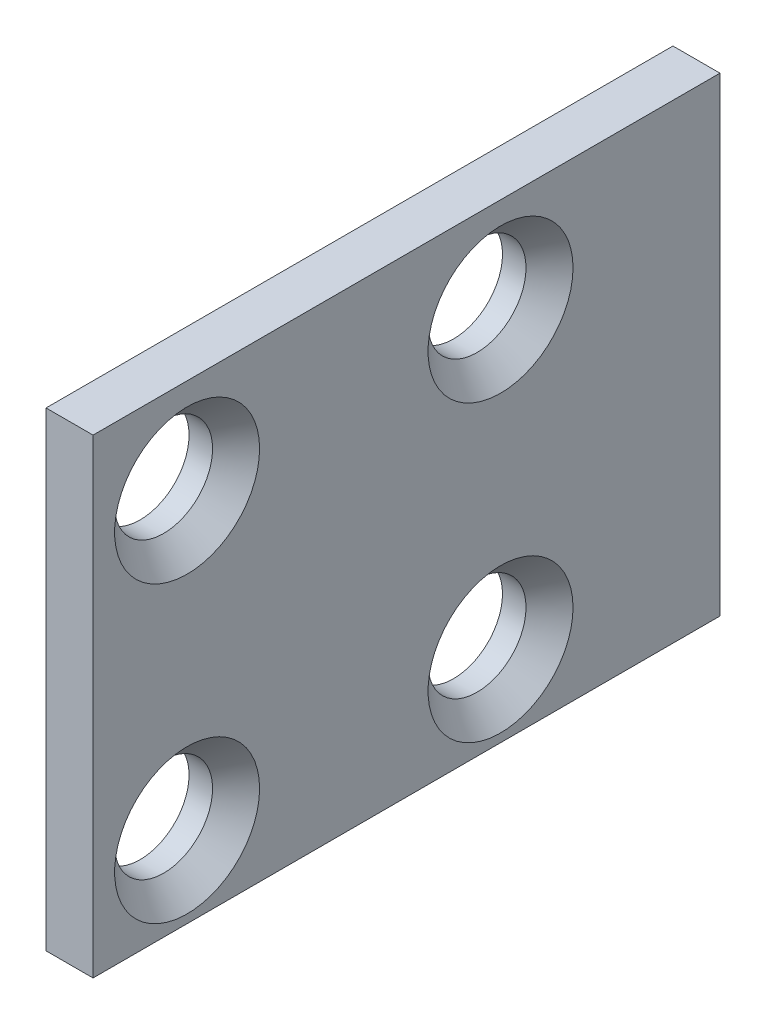
ISO-10303-21;
HEADER;
FILE_DESCRIPTION(('STEP AP214'),'2;1');
FILE_NAME('part.step','',(''),(''),'','','');
FILE_SCHEMA(('AUTOMOTIVE_DESIGN { 1 0 10303 214 1 1 1 1 }'));
ENDSEC;
DATA;
#1=APPLICATION_CONTEXT('core data for automotive mechanical design processes');
#2=APPLICATION_PROTOCOL_DEFINITION('international standard','automotive_design',2000,#1);
#3=PRODUCT_CONTEXT('',#1,'mechanical');
#4=PRODUCT('Part','Part','',(#3));
#5=PRODUCT_RELATED_PRODUCT_CATEGORY('part','',(#4));
#6=PRODUCT_DEFINITION_FORMATION('','',#4);
#7=PRODUCT_DEFINITION_CONTEXT('part definition',#1,'design');
#8=PRODUCT_DEFINITION('design','',#6,#7);
#9=PRODUCT_DEFINITION_SHAPE('','',#8);
#10=(LENGTH_UNIT() NAMED_UNIT(*) SI_UNIT(.MILLI.,.METRE.));
#11=(NAMED_UNIT(*) PLANE_ANGLE_UNIT() SI_UNIT($,.RADIAN.));
#12=(NAMED_UNIT(*) SI_UNIT($,.STERADIAN.) SOLID_ANGLE_UNIT());
#13=UNCERTAINTY_MEASURE_WITH_UNIT(LENGTH_MEASURE(1.E-05),#10,'distance_accuracy_value','');
#14=(GEOMETRIC_REPRESENTATION_CONTEXT(3) GLOBAL_UNCERTAINTY_ASSIGNED_CONTEXT((#13)) GLOBAL_UNIT_ASSIGNED_CONTEXT((#10,
#11,#12)) REPRESENTATION_CONTEXT('',''));
#15=CARTESIAN_POINT('',(0.,0.,0.));
#16=DIRECTION('',(0.,0.,1.));
#17=DIRECTION('',(1.,0.,0.));
#18=AXIS2_PLACEMENT_3D('',#15,#16,#17);
#19=CARTESIAN_POINT('',(6.,0.,0.));
#20=DIRECTION('',(1.,0.,0.));
#21=DIRECTION('',(0.,0.,-1.));
#22=AXIS2_PLACEMENT_3D('',#19,#20,#21);
#23=PLANE('',#22);
#24=CARTESIAN_POINT('',(6.,10.3277292459547,-12.));
#25=DIRECTION('',(1.,0.,0.));
#26=DIRECTION('',(0.,0.,-1.));
#27=AXIS2_PLACEMENT_3D('',#24,#25,#26);
#28=CIRCLE('',#27,9.25000000000005);
#29=CARTESIAN_POINT('',(6.,10.3277292459547,-21.2500000000001));
#30=VERTEX_POINT('',#29);
#31=EDGE_CURVE('E125',#30,#30,#28,.F.);
#32=ORIENTED_EDGE('',*,*,#31,.T.);
#33=EDGE_LOOP('',(#32));
#34=FACE_BOUND('',#33,.T.);
#35=CARTESIAN_POINT('',(6.,10.3277292459547,-52.));
#36=DIRECTION('',(1.,0.,0.));
#37=DIRECTION('',(0.,0.,-1.));
#38=AXIS2_PLACEMENT_3D('',#35,#36,#37);
#39=CIRCLE('',#38,9.25000000000003);
#40=CARTESIAN_POINT('',(6.,10.3277292459547,-61.25));
#41=VERTEX_POINT('',#40);
#42=EDGE_CURVE('E122',#41,#41,#39,.F.);
#43=ORIENTED_EDGE('',*,*,#42,.T.);
#44=EDGE_LOOP('',(#43));
#45=FACE_BOUND('',#44,.T.);
#46=CARTESIAN_POINT('',(6.,47.8722372206188,-52.));
#47=DIRECTION('',(1.,0.,0.));
#48=DIRECTION('',(0.,0.,-1.));
#49=AXIS2_PLACEMENT_3D('',#46,#47,#48);
#50=CIRCLE('',#49,9.25000000000006);
#51=CARTESIAN_POINT('',(6.,47.8722372206188,-61.2500000000001));
#52=VERTEX_POINT('',#51);
#53=EDGE_CURVE('E119',#52,#52,#50,.F.);
#54=ORIENTED_EDGE('',*,*,#53,.T.);
#55=EDGE_LOOP('',(#54));
#56=FACE_BOUND('',#55,.T.);
#57=CARTESIAN_POINT('',(6.,47.8722372206188,-12.));
#58=DIRECTION('',(1.,0.,0.));
#59=DIRECTION('',(0.,0.,-1.));
#60=AXIS2_PLACEMENT_3D('',#57,#58,#59);
#61=CIRCLE('',#60,9.25000000000002);
#62=CARTESIAN_POINT('',(6.,47.8722372206188,-21.25));
#63=VERTEX_POINT('',#62);
#64=EDGE_CURVE('E116',#63,#63,#61,.F.);
#65=ORIENTED_EDGE('',*,*,#64,.T.);
#66=EDGE_LOOP('',(#65));
#67=FACE_BOUND('',#66,.T.);
#68=DIRECTION('',(0.,-1.,0.));
#69=VECTOR('',#68,1.);
#70=CARTESIAN_POINT('',(6.,60.,0.));
#71=LINE('',#70,#69);
#72=CARTESIAN_POINT('',(6.,60.,0.));
#73=VERTEX_POINT('',#72);
#74=CARTESIAN_POINT('',(6.,0.,0.));
#75=VERTEX_POINT('',#74);
#76=EDGE_CURVE('E88',#73,#75,#71,.T.);
#77=ORIENTED_EDGE('',*,*,#76,.T.);
#78=DIRECTION('',(0.,0.,-1.));
#79=VECTOR('',#78,1.);
#80=CARTESIAN_POINT('',(6.,0.,0.));
#81=LINE('',#80,#79);
#82=CARTESIAN_POINT('',(6.,0.,-80.));
#83=VERTEX_POINT('',#82);
#84=EDGE_CURVE('E84',#75,#83,#81,.T.);
#85=ORIENTED_EDGE('',*,*,#84,.T.);
#86=DIRECTION('',(0.,1.,0.));
#87=VECTOR('',#86,1.);
#88=CARTESIAN_POINT('',(6.,0.,-80.));
#89=LINE('',#88,#87);
#90=CARTESIAN_POINT('',(6.,60.,-80.));
#91=VERTEX_POINT('',#90);
#92=EDGE_CURVE('E86',#83,#91,#89,.T.);
#93=ORIENTED_EDGE('',*,*,#92,.T.);
#94=DIRECTION('',(0.,0.,1.));
#95=VECTOR('',#94,1.);
#96=CARTESIAN_POINT('',(6.,60.,-80.));
#97=LINE('',#96,#95);
#98=EDGE_CURVE('E53',#91,#73,#97,.T.);
#99=ORIENTED_EDGE('',*,*,#98,.T.);
#100=EDGE_LOOP('',(#77,#85,#93,#99));
#101=FACE_BOUND('',#100,.T.);
#102=ADVANCED_FACE('F36',(#34,#45,#56,#67,#101),#23,.T.);
#103=CARTESIAN_POINT('',(0.,0.,0.));
#104=DIRECTION('',(1.,0.,0.));
#105=DIRECTION('',(0.,0.,-1.));
#106=AXIS2_PLACEMENT_3D('',#103,#104,#105);
#107=PLANE('',#106);
#108=DIRECTION('',(0.,-1.,0.));
#109=VECTOR('',#108,1.);
#110=CARTESIAN_POINT('',(0.,60.,0.));
#111=LINE('',#110,#109);
#112=CARTESIAN_POINT('',(0.,60.,0.));
#113=VERTEX_POINT('',#112);
#114=CARTESIAN_POINT('',(0.,0.,0.));
#115=VERTEX_POINT('',#114);
#116=EDGE_CURVE('E103',#113,#115,#111,.T.);
#117=ORIENTED_EDGE('',*,*,#116,.F.);
#118=DIRECTION('',(0.,0.,1.));
#119=VECTOR('',#118,1.);
#120=CARTESIAN_POINT('',(0.,60.,-80.));
#121=LINE('',#120,#119);
#122=CARTESIAN_POINT('',(0.,60.,-80.));
#123=VERTEX_POINT('',#122);
#124=EDGE_CURVE('E76',#123,#113,#121,.T.);
#125=ORIENTED_EDGE('',*,*,#124,.F.);
#126=DIRECTION('',(0.,1.,0.));
#127=VECTOR('',#126,1.);
#128=CARTESIAN_POINT('',(0.,0.,-80.));
#129=LINE('',#128,#127);
#130=CARTESIAN_POINT('',(0.,0.,-80.));
#131=VERTEX_POINT('',#130);
#132=EDGE_CURVE('E70',#131,#123,#129,.T.);
#133=ORIENTED_EDGE('',*,*,#132,.F.);
#134=DIRECTION('',(0.,0.,-1.));
#135=VECTOR('',#134,1.);
#136=CARTESIAN_POINT('',(0.,0.,0.));
#137=LINE('',#136,#135);
#138=EDGE_CURVE('E93',#115,#131,#137,.T.);
#139=ORIENTED_EDGE('',*,*,#138,.F.);
#140=EDGE_LOOP('',(#117,#125,#133,#139));
#141=FACE_BOUND('',#140,.T.);
#142=CARTESIAN_POINT('',(0.,10.3277292459547,-12.));
#143=DIRECTION('',(1.,0.,0.));
#144=DIRECTION('',(0.,0.,-1.));
#145=AXIS2_PLACEMENT_3D('',#142,#143,#144);
#146=CIRCLE('',#145,6.25);
#147=CARTESIAN_POINT('',(0.,10.3277292459547,-18.25));
#148=VERTEX_POINT('',#147);
#149=EDGE_CURVE('E106',#148,#148,#146,.T.);
#150=ORIENTED_EDGE('',*,*,#149,.T.);
#151=EDGE_LOOP('',(#150));
#152=FACE_BOUND('',#151,.T.);
#153=CARTESIAN_POINT('',(0.,47.8722372206188,-12.));
#154=DIRECTION('',(1.,0.,0.));
#155=DIRECTION('',(0.,0.,-1.));
#156=AXIS2_PLACEMENT_3D('',#153,#154,#155);
#157=CIRCLE('',#156,6.25);
#158=CARTESIAN_POINT('',(0.,47.8722372206188,-18.25));
#159=VERTEX_POINT('',#158);
#160=EDGE_CURVE('E192',#159,#159,#157,.T.);
#161=ORIENTED_EDGE('',*,*,#160,.T.);
#162=EDGE_LOOP('',(#161));
#163=FACE_BOUND('',#162,.T.);
#164=CARTESIAN_POINT('',(0.,47.8722372206188,-52.));
#165=DIRECTION('',(1.,0.,0.));
#166=DIRECTION('',(0.,0.,-1.));
#167=AXIS2_PLACEMENT_3D('',#164,#165,#166);
#168=CIRCLE('',#167,6.25000000000001);
#169=CARTESIAN_POINT('',(0.,47.8722372206188,-58.25));
#170=VERTEX_POINT('',#169);
#171=EDGE_CURVE('E195',#170,#170,#168,.T.);
#172=ORIENTED_EDGE('',*,*,#171,.T.);
#173=EDGE_LOOP('',(#172));
#174=FACE_BOUND('',#173,.T.);
#175=CARTESIAN_POINT('',(0.,10.3277292459547,-52.));
#176=DIRECTION('',(1.,0.,0.));
#177=DIRECTION('',(0.,0.,-1.));
#178=AXIS2_PLACEMENT_3D('',#175,#176,#177);
#179=CIRCLE('',#178,6.25);
#180=CARTESIAN_POINT('',(0.,10.3277292459547,-58.25));
#181=VERTEX_POINT('',#180);
#182=EDGE_CURVE('E200',#181,#181,#179,.T.);
#183=ORIENTED_EDGE('',*,*,#182,.T.);
#184=EDGE_LOOP('',(#183));
#185=FACE_BOUND('',#184,.T.);
#186=ADVANCED_FACE('F150',(#141,#152,#163,#174,#185),#107,.F.);
#187=CARTESIAN_POINT('',(6.,60.,0.));
#188=DIRECTION('',(0.,0.,-1.));
#189=DIRECTION('',(-1.,0.,0.));
#190=AXIS2_PLACEMENT_3D('',#187,#188,#189);
#191=PLANE('',#190);
#192=ORIENTED_EDGE('',*,*,#116,.T.);
#193=DIRECTION('',(-1.,0.,0.));
#194=VECTOR('',#193,1.);
#195=CARTESIAN_POINT('',(6.,0.,0.));
#196=LINE('',#195,#194);
#197=EDGE_CURVE('E94',#75,#115,#196,.T.);
#198=ORIENTED_EDGE('',*,*,#197,.F.);
#199=ORIENTED_EDGE('',*,*,#76,.F.);
#200=DIRECTION('',(-1.,0.,0.));
#201=VECTOR('',#200,1.);
#202=CARTESIAN_POINT('',(6.,60.,0.));
#203=LINE('',#202,#201);
#204=EDGE_CURVE('E99',#73,#113,#203,.T.);
#205=ORIENTED_EDGE('',*,*,#204,.T.);
#206=EDGE_LOOP('',(#192,#198,#199,#205));
#207=FACE_BOUND('',#206,.T.);
#208=ADVANCED_FACE('F156',(#207),#191,.F.);
#209=CARTESIAN_POINT('',(6.,0.,0.));
#210=DIRECTION('',(0.,1.,0.));
#211=DIRECTION('',(0.,0.,1.));
#212=AXIS2_PLACEMENT_3D('',#209,#210,#211);
#213=PLANE('',#212);
#214=ORIENTED_EDGE('',*,*,#138,.T.);
#215=DIRECTION('',(-1.,0.,0.));
#216=VECTOR('',#215,1.);
#217=CARTESIAN_POINT('',(6.,0.,-80.));
#218=LINE('',#217,#216);
#219=EDGE_CURVE('E91',#83,#131,#218,.T.);
#220=ORIENTED_EDGE('',*,*,#219,.F.);
#221=ORIENTED_EDGE('',*,*,#84,.F.);
#222=ORIENTED_EDGE('',*,*,#197,.T.);
#223=EDGE_LOOP('',(#214,#220,#221,#222));
#224=FACE_BOUND('',#223,.T.);
#225=ADVANCED_FACE('F92',(#224),#213,.F.);
#226=CARTESIAN_POINT('',(6.,0.,-80.));
#227=DIRECTION('',(0.,0.,1.));
#228=DIRECTION('',(1.,0.,0.));
#229=AXIS2_PLACEMENT_3D('',#226,#227,#228);
#230=PLANE('',#229);
#231=ORIENTED_EDGE('',*,*,#132,.T.);
#232=DIRECTION('',(-1.,0.,0.));
#233=VECTOR('',#232,1.);
#234=CARTESIAN_POINT('',(6.,60.,-80.));
#235=LINE('',#234,#233);
#236=EDGE_CURVE('E95',#91,#123,#235,.T.);
#237=ORIENTED_EDGE('',*,*,#236,.F.);
#238=ORIENTED_EDGE('',*,*,#92,.F.);
#239=ORIENTED_EDGE('',*,*,#219,.T.);
#240=EDGE_LOOP('',(#231,#237,#238,#239));
#241=FACE_BOUND('',#240,.T.);
#242=ADVANCED_FACE('F97',(#241),#230,.F.);
#243=CARTESIAN_POINT('',(6.,60.,-80.));
#244=DIRECTION('',(0.,-1.,0.));
#245=DIRECTION('',(0.,0.,-1.));
#246=AXIS2_PLACEMENT_3D('',#243,#244,#245);
#247=PLANE('',#246);
#248=ORIENTED_EDGE('',*,*,#124,.T.);
#249=ORIENTED_EDGE('',*,*,#204,.F.);
#250=ORIENTED_EDGE('',*,*,#98,.F.);
#251=ORIENTED_EDGE('',*,*,#236,.T.);
#252=EDGE_LOOP('',(#248,#249,#250,#251));
#253=FACE_BOUND('',#252,.T.);
#254=ADVANCED_FACE('F164',(#253),#247,.F.);
#255=CARTESIAN_POINT('',(6.,10.3277292459547,-12.));
#256=DIRECTION('',(-1.,0.,0.));
#257=DIRECTION('',(0.,0.,1.));
#258=AXIS2_PLACEMENT_3D('',#255,#256,#257);
#259=CYLINDRICAL_SURFACE('',#258,6.25);
#260=CARTESIAN_POINT('',(2.99999999999997,10.3277292459547,-12.));
#261=DIRECTION('',(1.,0.,0.));
#262=DIRECTION('',(0.,0.,-1.));
#263=AXIS2_PLACEMENT_3D('',#260,#261,#262);
#264=CIRCLE('',#263,6.25);
#265=CARTESIAN_POINT('',(2.99999999999997,10.3277292459547,-18.25));
#266=VERTEX_POINT('',#265);
#267=EDGE_CURVE('E113',#266,#266,#264,.T.);
#268=ORIENTED_EDGE('',*,*,#267,.T.);
#269=EDGE_LOOP('',(#268));
#270=FACE_BOUND('',#269,.T.);
#271=ORIENTED_EDGE('',*,*,#149,.F.);
#272=EDGE_LOOP('',(#271));
#273=FACE_BOUND('',#272,.T.);
#274=ADVANCED_FACE('F161',(#270,#273),#259,.F.);
#275=CARTESIAN_POINT('',(6.,47.8722372206188,-12.));
#276=DIRECTION('',(-1.,0.,0.));
#277=DIRECTION('',(0.,0.,1.));
#278=AXIS2_PLACEMENT_3D('',#275,#276,#277);
#279=CYLINDRICAL_SURFACE('',#278,6.25);
#280=CARTESIAN_POINT('',(2.99999999999998,47.8722372206188,-12.));
#281=DIRECTION('',(1.,0.,0.));
#282=DIRECTION('',(0.,0.,-1.));
#283=AXIS2_PLACEMENT_3D('',#280,#281,#282);
#284=CIRCLE('',#283,6.25);
#285=CARTESIAN_POINT('',(2.99999999999998,47.8722372206188,-18.25));
#286=VERTEX_POINT('',#285);
#287=EDGE_CURVE('E11',#286,#286,#284,.T.);
#288=ORIENTED_EDGE('',*,*,#287,.T.);
#289=EDGE_LOOP('',(#288));
#290=FACE_BOUND('',#289,.T.);
#291=ORIENTED_EDGE('',*,*,#160,.F.);
#292=EDGE_LOOP('',(#291));
#293=FACE_BOUND('',#292,.T.);
#294=ADVANCED_FACE('F188',(#290,#293),#279,.F.);
#295=CARTESIAN_POINT('',(6.,47.8722372206188,-52.));
#296=DIRECTION('',(-1.,0.,0.));
#297=DIRECTION('',(0.,0.,1.));
#298=AXIS2_PLACEMENT_3D('',#295,#296,#297);
#299=CYLINDRICAL_SURFACE('',#298,6.25000000000001);
#300=CARTESIAN_POINT('',(2.99999999999998,47.8722372206188,-52.));
#301=DIRECTION('',(1.,0.,0.));
#302=DIRECTION('',(0.,0.,-1.));
#303=AXIS2_PLACEMENT_3D('',#300,#301,#302);
#304=CIRCLE('',#303,6.25000000000001);
#305=CARTESIAN_POINT('',(2.99999999999998,47.8722372206188,-58.25));
#306=VERTEX_POINT('',#305);
#307=EDGE_CURVE('E45',#306,#306,#304,.T.);
#308=ORIENTED_EDGE('',*,*,#307,.T.);
#309=EDGE_LOOP('',(#308));
#310=FACE_BOUND('',#309,.T.);
#311=ORIENTED_EDGE('',*,*,#171,.F.);
#312=EDGE_LOOP('',(#311));
#313=FACE_BOUND('',#312,.T.);
#314=ADVANCED_FACE('F133',(#310,#313),#299,.F.);
#315=CARTESIAN_POINT('',(6.,10.3277292459547,-52.));
#316=DIRECTION('',(-1.,0.,0.));
#317=DIRECTION('',(0.,0.,1.));
#318=AXIS2_PLACEMENT_3D('',#315,#316,#317);
#319=CYLINDRICAL_SURFACE('',#318,6.25);
#320=CARTESIAN_POINT('',(2.99999999999999,10.3277292459547,-52.));
#321=DIRECTION('',(1.,0.,0.));
#322=DIRECTION('',(0.,0.,-1.));
#323=AXIS2_PLACEMENT_3D('',#320,#321,#322);
#324=CIRCLE('',#323,6.25);
#325=CARTESIAN_POINT('',(2.99999999999998,10.3277292459547,-58.25));
#326=VERTEX_POINT('',#325);
#327=EDGE_CURVE('E128',#326,#326,#324,.T.);
#328=ORIENTED_EDGE('',*,*,#327,.T.);
#329=EDGE_LOOP('',(#328));
#330=FACE_BOUND('',#329,.T.);
#331=ORIENTED_EDGE('',*,*,#182,.F.);
#332=EDGE_LOOP('',(#331));
#333=FACE_BOUND('',#332,.T.);
#334=ADVANCED_FACE('F175',(#330,#333),#319,.F.);
#335=CARTESIAN_POINT('',(2.99999999999997,10.3277292459547,-12.));
#336=DIRECTION('',(1.,0.,0.));
#337=DIRECTION('',(0.,0.,-1.));
#338=AXIS2_PLACEMENT_3D('',#335,#336,#337);
#339=CONICAL_SURFACE('',#338,6.25,0.785398163397452);
#340=ORIENTED_EDGE('',*,*,#31,.F.);
#341=EDGE_LOOP('',(#340));
#342=FACE_BOUND('',#341,.T.);
#343=ORIENTED_EDGE('',*,*,#267,.F.);
#344=EDGE_LOOP('',(#343));
#345=FACE_BOUND('',#344,.T.);
#346=ADVANCED_FACE('F145',(#342,#345),#339,.F.);
#347=CARTESIAN_POINT('',(2.99999999999999,10.3277292459547,-52.));
#348=DIRECTION('',(1.,0.,0.));
#349=DIRECTION('',(0.,0.,-1.));
#350=AXIS2_PLACEMENT_3D('',#347,#348,#349);
#351=CONICAL_SURFACE('',#350,6.25,0.78539816339745);
#352=CARTESIAN_POINT('',(6.,10.3277292459547,-61.25));
#353=CARTESIAN_POINT('',(5.96875,10.3277292459547,-61.21875));
#354=CARTESIAN_POINT('',(5.9375,10.3277292459547,-61.1875));
#355=CARTESIAN_POINT('',(5.875,10.3277292459547,-61.125));
#356=CARTESIAN_POINT('',(5.84375,10.3277292459547,-61.09375));
#357=CARTESIAN_POINT('',(5.78125,10.3277292459547,-61.03125));
#358=CARTESIAN_POINT('',(5.75,10.3277292459547,-61.));
#359=CARTESIAN_POINT('',(5.6875,10.3277292459547,-60.9375));
#360=CARTESIAN_POINT('',(5.65625,10.3277292459547,-60.90625));
#361=CARTESIAN_POINT('',(5.59375,10.3277292459547,-60.84375));
#362=CARTESIAN_POINT('',(5.5625,10.3277292459547,-60.8125));
#363=CARTESIAN_POINT('',(5.5,10.3277292459547,-60.75));
#364=CARTESIAN_POINT('',(5.46875,10.3277292459547,-60.71875));
#365=CARTESIAN_POINT('',(5.40625,10.3277292459547,-60.65625));
#366=CARTESIAN_POINT('',(5.375,10.3277292459547,-60.625));
#367=CARTESIAN_POINT('',(5.3125,10.3277292459547,-60.5625));
#368=CARTESIAN_POINT('',(5.28125,10.3277292459547,-60.53125));
#369=CARTESIAN_POINT('',(5.21875,10.3277292459547,-60.46875));
#370=CARTESIAN_POINT('',(5.1875,10.3277292459547,-60.4375));
#371=CARTESIAN_POINT('',(5.12499999999999,10.3277292459547,-60.375));
#372=CARTESIAN_POINT('',(5.09374999999999,10.3277292459547,-60.34375));
#373=CARTESIAN_POINT('',(5.03124999999999,10.3277292459547,-60.28125));
#374=CARTESIAN_POINT('',(4.99999999999999,10.3277292459547,-60.25));
#375=CARTESIAN_POINT('',(4.93749999999999,10.3277292459547,-60.1875));
#376=CARTESIAN_POINT('',(4.90624999999999,10.3277292459547,-60.15625));
#377=CARTESIAN_POINT('',(4.84374999999999,10.3277292459547,-60.09375));
#378=CARTESIAN_POINT('',(4.81249999999999,10.3277292459547,-60.0625));
#379=CARTESIAN_POINT('',(4.74999999999999,10.3277292459547,-60.));
#380=CARTESIAN_POINT('',(4.71874999999999,10.3277292459547,-59.96875));
#381=CARTESIAN_POINT('',(4.65624999999999,10.3277292459547,-59.90625));
#382=CARTESIAN_POINT('',(4.62499999999999,10.3277292459547,-59.875));
#383=CARTESIAN_POINT('',(4.56249999999999,10.3277292459547,-59.8125));
#384=CARTESIAN_POINT('',(4.53124999999999,10.3277292459547,-59.78125));
#385=CARTESIAN_POINT('',(4.46874999999999,10.3277292459547,-59.71875));
#386=CARTESIAN_POINT('',(4.43749999999999,10.3277292459547,-59.6875));
#387=CARTESIAN_POINT('',(4.37499999999999,10.3277292459547,-59.625));
#388=CARTESIAN_POINT('',(4.34374999999999,10.3277292459547,-59.59375));
#389=CARTESIAN_POINT('',(4.28124999999999,10.3277292459547,-59.53125));
#390=CARTESIAN_POINT('',(4.24999999999999,10.3277292459547,-59.5));
#391=CARTESIAN_POINT('',(4.18749999999999,10.3277292459547,-59.4375));
#392=CARTESIAN_POINT('',(4.15624999999999,10.3277292459547,-59.40625));
#393=CARTESIAN_POINT('',(4.09374999999999,10.3277292459547,-59.34375));
#394=CARTESIAN_POINT('',(4.06249999999999,10.3277292459547,-59.3125));
#395=CARTESIAN_POINT('',(3.99999999999999,10.3277292459547,-59.25));
#396=CARTESIAN_POINT('',(3.96874999999999,10.3277292459547,-59.21875));
#397=CARTESIAN_POINT('',(3.90624999999999,10.3277292459547,-59.15625));
#398=CARTESIAN_POINT('',(3.87499999999999,10.3277292459547,-59.125));
#399=CARTESIAN_POINT('',(3.81249999999999,10.3277292459547,-59.0625));
#400=CARTESIAN_POINT('',(3.78124999999999,10.3277292459547,-59.03125));
#401=CARTESIAN_POINT('',(3.71874999999999,10.3277292459547,-58.96875));
#402=CARTESIAN_POINT('',(3.68749999999999,10.3277292459547,-58.9375));
#403=CARTESIAN_POINT('',(3.62499999999999,10.3277292459547,-58.875));
#404=CARTESIAN_POINT('',(3.59374999999999,10.3277292459547,-58.84375));
#405=CARTESIAN_POINT('',(3.53124999999999,10.3277292459547,-58.78125));
#406=CARTESIAN_POINT('',(3.49999999999999,10.3277292459547,-58.75));
#407=CARTESIAN_POINT('',(3.43749999999999,10.3277292459547,-58.6875));
#408=CARTESIAN_POINT('',(3.40624999999999,10.3277292459547,-58.65625));
#409=CARTESIAN_POINT('',(3.34374999999999,10.3277292459547,-58.59375));
#410=CARTESIAN_POINT('',(3.31249999999999,10.3277292459547,-58.5625));
#411=CARTESIAN_POINT('',(3.24999999999999,10.3277292459547,-58.5));
#412=CARTESIAN_POINT('',(3.21874999999999,10.3277292459547,-58.46875));
#413=CARTESIAN_POINT('',(3.15624999999998,10.3277292459547,-58.40625));
#414=CARTESIAN_POINT('',(3.12499999999998,10.3277292459547,-58.375));
#415=CARTESIAN_POINT('',(3.06249999999999,10.3277292459547,-58.3125));
#416=CARTESIAN_POINT('',(3.03124999999999,10.3277292459547,-58.28125));
#417=CARTESIAN_POINT('',(2.99999999999998,10.3277292459547,-58.25));
#418=B_SPLINE_CURVE_WITH_KNOTS('',3,(#352,#353,#354,#355,#356,#357,#358,#359,#360,#361,#362,
#363,#364,#365,#366,#367,#368,#369,#370,#371,#372,#373,#374,#375,#376,#377,#378,#379,#380,#381,
#382,#383,#384,#385,#386,#387,#388,#389,#390,#391,#392,#393,#394,#395,#396,#397,#398,#399,#400,
#401,#402,#403,#404,#405,#406,#407,#408,#409,#410,#411,#412,#413,#414,#415,#416,#417),
.UNSPECIFIED.,.F.,.F.,(4,2,2,2,2,2,2,2,2,2,2,2,2,2,2,2,2,2,2,2,2,2,2,2,2,2,2,2,2,2,2,2,4),(0.,
0.132582521472481,0.265165042944957,0.397747564417437,0.530330085889912,0.662912607362393,
0.795495128834874,0.928077650307349,1.06066017177983,1.1932426932523,1.32582521472479,
1.45840773619727,1.59099025766975,1.72357277914222,1.8561553006147,1.98873782208718,
2.12132034355966,2.25390286503214,2.38648538650461,2.5190679079771,2.65165042944957,
2.78423295092205,2.91681547239453,3.04939799386701,3.18198051533949,3.31456303681196,
3.44714555828444,3.57972807975692,3.7123106012294,3.84489312270188,3.97747564417436,
4.11005816564684,4.24264068711932),.UNSPECIFIED.);
#419=EDGE_CURVE('BSEAM138',#41,#326,#418,.T.);
#420=ORIENTED_EDGE('',*,*,#42,.F.);
#421=ORIENTED_EDGE('',*,*,#327,.F.);
#422=ORIENTED_EDGE('',*,*,#419,.T.);
#423=ORIENTED_EDGE('',*,*,#419,.F.);
#424=EDGE_LOOP('',(#420,#422,#421,#423));
#425=FACE_BOUND('',#424,.T.);
#426=ADVANCED_FACE('F138',(#425),#351,.F.);
#427=CARTESIAN_POINT('',(2.99999999999998,47.8722372206188,-52.));
#428=DIRECTION('',(1.,0.,0.));
#429=DIRECTION('',(0.,0.,-1.));
#430=AXIS2_PLACEMENT_3D('',#427,#428,#429);
#431=CONICAL_SURFACE('',#430,6.25000000000001,0.785398163397453);
#432=ORIENTED_EDGE('',*,*,#53,.F.);
#433=EDGE_LOOP('',(#432));
#434=FACE_BOUND('',#433,.T.);
#435=ORIENTED_EDGE('',*,*,#307,.F.);
#436=EDGE_LOOP('',(#435));
#437=FACE_BOUND('',#436,.T.);
#438=ADVANCED_FACE('F136',(#434,#437),#431,.F.);
#439=CARTESIAN_POINT('',(2.99999999999998,47.8722372206188,-12.));
#440=DIRECTION('',(1.,0.,0.));
#441=DIRECTION('',(0.,0.,-1.));
#442=AXIS2_PLACEMENT_3D('',#439,#440,#441);
#443=CONICAL_SURFACE('',#442,6.25,0.785398163397449);
#444=ORIENTED_EDGE('',*,*,#64,.F.);
#445=EDGE_LOOP('',(#444));
#446=FACE_BOUND('',#445,.T.);
#447=ORIENTED_EDGE('',*,*,#287,.F.);
#448=EDGE_LOOP('',(#447));
#449=FACE_BOUND('',#448,.T.);
#450=ADVANCED_FACE('F38',(#446,#449),#443,.F.);
#451=CLOSED_SHELL('',(#102,#186,#208,#225,#242,#254,#274,#294,#314,#334,#346,#426,#438,#450));
#452=MANIFOLD_SOLID_BREP('B2',#451);
#453=ADVANCED_BREP_SHAPE_REPRESENTATION('',(#18,#452),#14);
#454=SHAPE_DEFINITION_REPRESENTATION(#9,#453);
ENDSEC;
END-ISO-10303-21;
